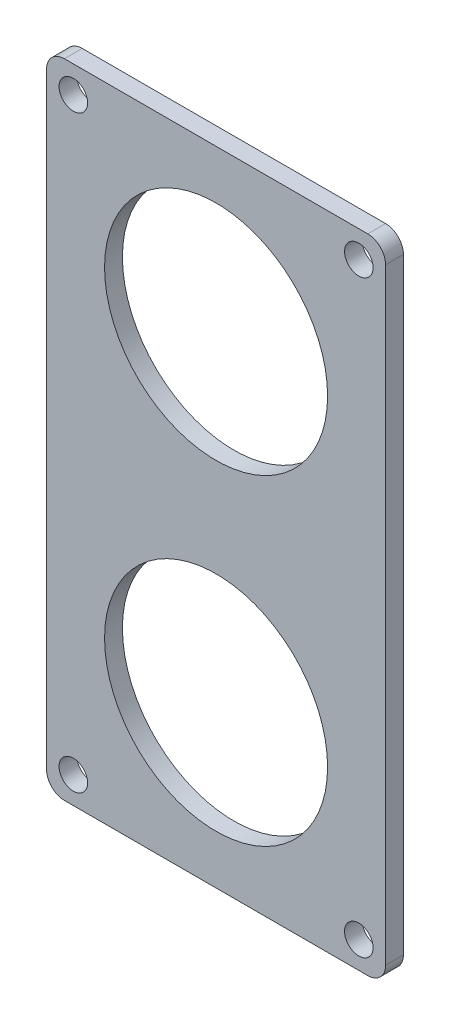
ISO-10303-21;
HEADER;
FILE_DESCRIPTION(('STEP AP214'),'2;1');
FILE_NAME('part.step','',(''),(''),'','','');
FILE_SCHEMA(('AUTOMOTIVE_DESIGN { 1 0 10303 214 1 1 1 1 }'));
ENDSEC;
DATA;
#1=APPLICATION_CONTEXT('core data for automotive mechanical design processes');
#2=APPLICATION_PROTOCOL_DEFINITION('international standard','automotive_design',2000,#1);
#3=PRODUCT_CONTEXT('',#1,'mechanical');
#4=PRODUCT('Part','Part','',(#3));
#5=PRODUCT_RELATED_PRODUCT_CATEGORY('part','',(#4));
#6=PRODUCT_DEFINITION_FORMATION('','',#4);
#7=PRODUCT_DEFINITION_CONTEXT('part definition',#1,'design');
#8=PRODUCT_DEFINITION('design','',#6,#7);
#9=PRODUCT_DEFINITION_SHAPE('','',#8);
#10=(LENGTH_UNIT() NAMED_UNIT(*) SI_UNIT(.MILLI.,.METRE.));
#11=(NAMED_UNIT(*) PLANE_ANGLE_UNIT() SI_UNIT($,.RADIAN.));
#12=(NAMED_UNIT(*) SI_UNIT($,.STERADIAN.) SOLID_ANGLE_UNIT());
#13=UNCERTAINTY_MEASURE_WITH_UNIT(LENGTH_MEASURE(1.E-05),#10,'distance_accuracy_value','');
#14=(GEOMETRIC_REPRESENTATION_CONTEXT(3) GLOBAL_UNCERTAINTY_ASSIGNED_CONTEXT((#13)) GLOBAL_UNIT_ASSIGNED_CONTEXT((#10,
#11,#12)) REPRESENTATION_CONTEXT('',''));
#15=CARTESIAN_POINT('',(0.,0.,0.));
#16=DIRECTION('',(0.,0.,1.));
#17=DIRECTION('',(1.,0.,0.));
#18=AXIS2_PLACEMENT_3D('',#15,#16,#17);
#19=CARTESIAN_POINT('',(20.5,54.2999999999998,2.));
#20=DIRECTION('',(0.,0.,1.));
#21=DIRECTION('',(1.,0.,0.));
#22=AXIS2_PLACEMENT_3D('',#19,#20,#21);
#23=PLANE('',#22);
#24=CARTESIAN_POINT('',(1.49999999999999,36.2999999999998,2.));
#25=DIRECTION('',(0.,0.,1.));
#26=DIRECTION('',(1.,0.,0.));
#27=AXIS2_PLACEMENT_3D('',#24,#25,#26);
#28=CIRCLE('',#27,12.5);
#29=CARTESIAN_POINT('',(14.,36.2999999999998,2.));
#30=VERTEX_POINT('',#29);
#31=EDGE_CURVE('E207',#30,#30,#28,.T.);
#32=ORIENTED_EDGE('',*,*,#31,.F.);
#33=EDGE_LOOP('',(#32));
#34=FACE_BOUND('',#33,.T.);
#35=CARTESIAN_POINT('',(1.49999999999999,0.299999999999835,2.));
#36=DIRECTION('',(0.,0.,1.));
#37=DIRECTION('',(1.,0.,0.));
#38=AXIS2_PLACEMENT_3D('',#35,#36,#37);
#39=CIRCLE('',#38,12.5);
#40=CARTESIAN_POINT('',(14.,0.299999999999835,2.));
#41=VERTEX_POINT('',#40);
#42=EDGE_CURVE('E201',#41,#41,#39,.T.);
#43=ORIENTED_EDGE('',*,*,#42,.F.);
#44=EDGE_LOOP('',(#43));
#45=FACE_BOUND('',#44,.T.);
#46=CARTESIAN_POINT('',(17.5,51.2999999999998,2.));
#47=DIRECTION('',(0.,0.,1.));
#48=DIRECTION('',(1.,0.,0.));
#49=AXIS2_PLACEMENT_3D('',#46,#47,#48);
#50=CIRCLE('',#49,1.6);
#51=CARTESIAN_POINT('',(19.1,51.2999999999998,2.));
#52=VERTEX_POINT('',#51);
#53=EDGE_CURVE('E186',#52,#52,#50,.T.);
#54=ORIENTED_EDGE('',*,*,#53,.F.);
#55=EDGE_LOOP('',(#54));
#56=FACE_BOUND('',#55,.T.);
#57=CARTESIAN_POINT('',(17.5,-14.7000000000002,2.));
#58=DIRECTION('',(0.,0.,1.));
#59=DIRECTION('',(1.,0.,0.));
#60=AXIS2_PLACEMENT_3D('',#57,#58,#59);
#61=CIRCLE('',#60,1.6);
#62=CARTESIAN_POINT('',(19.1,-14.7000000000002,2.));
#63=VERTEX_POINT('',#62);
#64=EDGE_CURVE('E172',#63,#63,#61,.T.);
#65=ORIENTED_EDGE('',*,*,#64,.F.);
#66=EDGE_LOOP('',(#65));
#67=FACE_BOUND('',#66,.T.);
#68=DIRECTION('',(-1.,0.,0.));
#69=VECTOR('',#68,1.);
#70=CARTESIAN_POINT('',(20.5,54.2999999999998,2.));
#71=LINE('',#70,#69);
#72=CARTESIAN_POINT('',(18.5,54.2999999999998,2.));
#73=VERTEX_POINT('',#72);
#74=CARTESIAN_POINT('',(-15.5,54.2999999999998,2.));
#75=VERTEX_POINT('',#74);
#76=EDGE_CURVE('E167',#73,#75,#71,.T.);
#77=ORIENTED_EDGE('',*,*,#76,.T.);
#78=CARTESIAN_POINT('',(-15.5,52.2999999999998,2.));
#79=DIRECTION('',(0.,0.,1.));
#80=DIRECTION('',(1.,0.,0.));
#81=AXIS2_PLACEMENT_3D('',#78,#79,#80);
#82=CIRCLE('',#81,2.);
#83=CARTESIAN_POINT('',(-17.5,52.2999999999998,2.));
#84=VERTEX_POINT('',#83);
#85=EDGE_CURVE('E148',#75,#84,#82,.T.);
#86=ORIENTED_EDGE('',*,*,#85,.T.);
#87=DIRECTION('',(0.,-1.,0.));
#88=VECTOR('',#87,1.);
#89=CARTESIAN_POINT('',(-17.5,-17.7000000000002,2.));
#90=LINE('',#89,#88);
#91=CARTESIAN_POINT('',(-17.5,-15.7000000000002,2.));
#92=VERTEX_POINT('',#91);
#93=EDGE_CURVE('E118',#84,#92,#90,.T.);
#94=ORIENTED_EDGE('',*,*,#93,.T.);
#95=CARTESIAN_POINT('',(-15.5,-15.7000000000002,2.));
#96=DIRECTION('',(0.,0.,1.));
#97=DIRECTION('',(1.,0.,0.));
#98=AXIS2_PLACEMENT_3D('',#95,#96,#97);
#99=CIRCLE('',#98,2.);
#100=CARTESIAN_POINT('',(-15.5,-17.7000000000002,2.));
#101=VERTEX_POINT('',#100);
#102=EDGE_CURVE('E54',#92,#101,#99,.T.);
#103=ORIENTED_EDGE('',*,*,#102,.T.);
#104=DIRECTION('',(1.,0.,0.));
#105=VECTOR('',#104,1.);
#106=CARTESIAN_POINT('',(20.5,-17.7000000000002,2.));
#107=LINE('',#106,#105);
#108=CARTESIAN_POINT('',(18.5,-17.7000000000002,2.));
#109=VERTEX_POINT('',#108);
#110=EDGE_CURVE('E134',#101,#109,#107,.T.);
#111=ORIENTED_EDGE('',*,*,#110,.T.);
#112=CARTESIAN_POINT('',(18.5,-15.7000000000002,2.));
#113=DIRECTION('',(0.,0.,1.));
#114=DIRECTION('',(1.,0.,0.));
#115=AXIS2_PLACEMENT_3D('',#112,#113,#114);
#116=CIRCLE('',#115,2.);
#117=CARTESIAN_POINT('',(20.5,-15.7000000000002,2.));
#118=VERTEX_POINT('',#117);
#119=EDGE_CURVE('E145',#109,#118,#116,.T.);
#120=ORIENTED_EDGE('',*,*,#119,.T.);
#121=DIRECTION('',(0.,1.,0.));
#122=VECTOR('',#121,1.);
#123=CARTESIAN_POINT('',(20.5,-17.7000000000002,2.));
#124=LINE('',#123,#122);
#125=CARTESIAN_POINT('',(20.5,52.2999999999998,2.));
#126=VERTEX_POINT('',#125);
#127=EDGE_CURVE('E128',#118,#126,#124,.T.);
#128=ORIENTED_EDGE('',*,*,#127,.T.);
#129=CARTESIAN_POINT('',(18.5,52.2999999999998,2.));
#130=DIRECTION('',(0.,0.,1.));
#131=DIRECTION('',(1.,0.,0.));
#132=AXIS2_PLACEMENT_3D('',#129,#130,#131);
#133=CIRCLE('',#132,2.);
#134=EDGE_CURVE('E143',#126,#73,#133,.T.);
#135=ORIENTED_EDGE('',*,*,#134,.T.);
#136=EDGE_LOOP('',(#77,#86,#94,#103,#111,#120,#128,#135));
#137=FACE_BOUND('',#136,.T.);
#138=CARTESIAN_POINT('',(-14.5,-14.7000000000002,2.));
#139=DIRECTION('',(0.,0.,1.));
#140=DIRECTION('',(1.,0.,0.));
#141=AXIS2_PLACEMENT_3D('',#138,#139,#140);
#142=CIRCLE('',#141,1.6);
#143=CARTESIAN_POINT('',(-12.9,-14.7000000000002,2.));
#144=VERTEX_POINT('',#143);
#145=EDGE_CURVE('E181',#144,#144,#142,.T.);
#146=ORIENTED_EDGE('',*,*,#145,.F.);
#147=EDGE_LOOP('',(#146));
#148=FACE_BOUND('',#147,.T.);
#149=CARTESIAN_POINT('',(-14.5,51.2999999999998,2.));
#150=DIRECTION('',(0.,0.,1.));
#151=DIRECTION('',(1.,0.,0.));
#152=AXIS2_PLACEMENT_3D('',#149,#150,#151);
#153=CIRCLE('',#152,1.6);
#154=CARTESIAN_POINT('',(-12.9,51.2999999999998,2.));
#155=VERTEX_POINT('',#154);
#156=EDGE_CURVE('E192',#155,#155,#153,.T.);
#157=ORIENTED_EDGE('',*,*,#156,.F.);
#158=EDGE_LOOP('',(#157));
#159=FACE_BOUND('',#158,.T.);
#160=ADVANCED_FACE('F32',(#34,#45,#56,#67,#137,#148,#159),#23,.T.);
#161=CARTESIAN_POINT('',(20.5,54.2999999999998,0.));
#162=DIRECTION('',(0.,0.,1.));
#163=DIRECTION('',(1.,0.,0.));
#164=AXIS2_PLACEMENT_3D('',#161,#162,#163);
#165=PLANE('',#164);
#166=CARTESIAN_POINT('',(1.49999999999999,36.2999999999998,0.));
#167=DIRECTION('',(0.,0.,1.));
#168=DIRECTION('',(1.,0.,0.));
#169=AXIS2_PLACEMENT_3D('',#166,#167,#168);
#170=CIRCLE('',#169,12.5);
#171=CARTESIAN_POINT('',(14.,36.2999999999998,0.));
#172=VERTEX_POINT('',#171);
#173=EDGE_CURVE('E204',#172,#172,#170,.T.);
#174=ORIENTED_EDGE('',*,*,#173,.T.);
#175=EDGE_LOOP('',(#174));
#176=FACE_BOUND('',#175,.T.);
#177=CARTESIAN_POINT('',(1.49999999999999,0.299999999999835,0.));
#178=DIRECTION('',(0.,0.,1.));
#179=DIRECTION('',(1.,0.,0.));
#180=AXIS2_PLACEMENT_3D('',#177,#178,#179);
#181=CIRCLE('',#180,12.5);
#182=CARTESIAN_POINT('',(14.,0.299999999999835,0.));
#183=VERTEX_POINT('',#182);
#184=EDGE_CURVE('E198',#183,#183,#181,.T.);
#185=ORIENTED_EDGE('',*,*,#184,.T.);
#186=EDGE_LOOP('',(#185));
#187=FACE_BOUND('',#186,.T.);
#188=CARTESIAN_POINT('',(17.5,51.2999999999998,0.));
#189=DIRECTION('',(0.,0.,1.));
#190=DIRECTION('',(1.,0.,0.));
#191=AXIS2_PLACEMENT_3D('',#188,#189,#190);
#192=CIRCLE('',#191,1.6);
#193=CARTESIAN_POINT('',(19.1,51.2999999999998,0.));
#194=VERTEX_POINT('',#193);
#195=EDGE_CURVE('E189',#194,#194,#192,.T.);
#196=ORIENTED_EDGE('',*,*,#195,.T.);
#197=EDGE_LOOP('',(#196));
#198=FACE_BOUND('',#197,.T.);
#199=CARTESIAN_POINT('',(17.5,-14.7000000000002,0.));
#200=DIRECTION('',(0.,0.,1.));
#201=DIRECTION('',(1.,0.,0.));
#202=AXIS2_PLACEMENT_3D('',#199,#200,#201);
#203=CIRCLE('',#202,1.6);
#204=CARTESIAN_POINT('',(19.1,-14.7000000000002,0.));
#205=VERTEX_POINT('',#204);
#206=EDGE_CURVE('E174',#205,#205,#203,.T.);
#207=ORIENTED_EDGE('',*,*,#206,.T.);
#208=EDGE_LOOP('',(#207));
#209=FACE_BOUND('',#208,.T.);
#210=DIRECTION('',(0.,-1.,0.));
#211=VECTOR('',#210,1.);
#212=CARTESIAN_POINT('',(-17.5,-17.7000000000002,0.));
#213=LINE('',#212,#211);
#214=CARTESIAN_POINT('',(-17.5,52.2999999999998,0.));
#215=VERTEX_POINT('',#214);
#216=CARTESIAN_POINT('',(-17.5,-15.7000000000002,0.));
#217=VERTEX_POINT('',#216);
#218=EDGE_CURVE('E116',#215,#217,#213,.T.);
#219=ORIENTED_EDGE('',*,*,#218,.F.);
#220=CARTESIAN_POINT('',(-15.5,52.2999999999998,0.));
#221=DIRECTION('',(0.,0.,1.));
#222=DIRECTION('',(1.,0.,0.));
#223=AXIS2_PLACEMENT_3D('',#220,#221,#222);
#224=CIRCLE('',#223,2.);
#225=CARTESIAN_POINT('',(-15.5,54.2999999999998,0.));
#226=VERTEX_POINT('',#225);
#227=EDGE_CURVE('E99',#215,#226,#224,.F.);
#228=ORIENTED_EDGE('',*,*,#227,.T.);
#229=DIRECTION('',(-1.,0.,0.));
#230=VECTOR('',#229,1.);
#231=CARTESIAN_POINT('',(20.5,54.2999999999998,0.));
#232=LINE('',#231,#230);
#233=CARTESIAN_POINT('',(18.5,54.2999999999998,0.));
#234=VERTEX_POINT('',#233);
#235=EDGE_CURVE('E126',#234,#226,#232,.T.);
#236=ORIENTED_EDGE('',*,*,#235,.F.);
#237=CARTESIAN_POINT('',(18.5,52.2999999999998,0.));
#238=DIRECTION('',(0.,0.,1.));
#239=DIRECTION('',(1.,0.,0.));
#240=AXIS2_PLACEMENT_3D('',#237,#238,#239);
#241=CIRCLE('',#240,2.);
#242=CARTESIAN_POINT('',(20.5,52.2999999999998,0.));
#243=VERTEX_POINT('',#242);
#244=EDGE_CURVE('E119',#234,#243,#241,.F.);
#245=ORIENTED_EDGE('',*,*,#244,.T.);
#246=DIRECTION('',(0.,1.,0.));
#247=VECTOR('',#246,1.);
#248=CARTESIAN_POINT('',(20.5,-17.7000000000002,0.));
#249=LINE('',#248,#247);
#250=CARTESIAN_POINT('',(20.5,-15.7000000000002,0.));
#251=VERTEX_POINT('',#250);
#252=EDGE_CURVE('E130',#251,#243,#249,.T.);
#253=ORIENTED_EDGE('',*,*,#252,.F.);
#254=CARTESIAN_POINT('',(18.5,-15.7000000000002,0.));
#255=DIRECTION('',(0.,0.,1.));
#256=DIRECTION('',(1.,0.,0.));
#257=AXIS2_PLACEMENT_3D('',#254,#255,#256);
#258=CIRCLE('',#257,2.);
#259=CARTESIAN_POINT('',(18.5,-17.7000000000002,0.));
#260=VERTEX_POINT('',#259);
#261=EDGE_CURVE('E137',#251,#260,#258,.F.);
#262=ORIENTED_EDGE('',*,*,#261,.T.);
#263=DIRECTION('',(1.,0.,0.));
#264=VECTOR('',#263,1.);
#265=CARTESIAN_POINT('',(20.5,-17.7000000000002,0.));
#266=LINE('',#265,#264);
#267=CARTESIAN_POINT('',(-15.5,-17.7000000000002,0.));
#268=VERTEX_POINT('',#267);
#269=EDGE_CURVE('E125',#268,#260,#266,.T.);
#270=ORIENTED_EDGE('',*,*,#269,.F.);
#271=CARTESIAN_POINT('',(-15.5,-15.7000000000002,0.));
#272=DIRECTION('',(0.,0.,1.));
#273=DIRECTION('',(1.,0.,0.));
#274=AXIS2_PLACEMENT_3D('',#271,#272,#273);
#275=CIRCLE('',#274,2.);
#276=EDGE_CURVE('E110',#268,#217,#275,.F.);
#277=ORIENTED_EDGE('',*,*,#276,.T.);
#278=EDGE_LOOP('',(#219,#228,#236,#245,#253,#262,#270,#277));
#279=FACE_BOUND('',#278,.T.);
#280=CARTESIAN_POINT('',(-14.5,-14.7000000000002,0.));
#281=DIRECTION('',(0.,0.,1.));
#282=DIRECTION('',(1.,0.,0.));
#283=AXIS2_PLACEMENT_3D('',#280,#281,#282);
#284=CIRCLE('',#283,1.6);
#285=CARTESIAN_POINT('',(-12.9,-14.7000000000002,0.));
#286=VERTEX_POINT('',#285);
#287=EDGE_CURVE('E183',#286,#286,#284,.T.);
#288=ORIENTED_EDGE('',*,*,#287,.T.);
#289=EDGE_LOOP('',(#288));
#290=FACE_BOUND('',#289,.T.);
#291=CARTESIAN_POINT('',(-14.5,51.2999999999998,0.));
#292=DIRECTION('',(0.,0.,1.));
#293=DIRECTION('',(1.,0.,0.));
#294=AXIS2_PLACEMENT_3D('',#291,#292,#293);
#295=CIRCLE('',#294,1.6);
#296=CARTESIAN_POINT('',(-12.9,51.2999999999998,0.));
#297=VERTEX_POINT('',#296);
#298=EDGE_CURVE('E195',#297,#297,#295,.T.);
#299=ORIENTED_EDGE('',*,*,#298,.T.);
#300=EDGE_LOOP('',(#299));
#301=FACE_BOUND('',#300,.T.);
#302=ADVANCED_FACE('F122',(#176,#187,#198,#209,#279,#290,#301),#165,.F.);
#303=CARTESIAN_POINT('',(20.5,-17.7000000000002,2.));
#304=DIRECTION('',(-1.,0.,0.));
#305=DIRECTION('',(0.,0.,1.));
#306=AXIS2_PLACEMENT_3D('',#303,#304,#305);
#307=PLANE('',#306);
#308=ORIENTED_EDGE('',*,*,#127,.F.);
#309=DIRECTION('',(0.,0.,-1.));
#310=VECTOR('',#309,1.);
#311=CARTESIAN_POINT('',(20.5,-15.7000000000002,2.));
#312=LINE('',#311,#310);
#313=EDGE_CURVE('E11',#118,#251,#312,.T.);
#314=ORIENTED_EDGE('',*,*,#313,.T.);
#315=ORIENTED_EDGE('',*,*,#252,.T.);
#316=DIRECTION('',(0.,0.,-1.));
#317=VECTOR('',#316,1.);
#318=CARTESIAN_POINT('',(20.5,52.2999999999998,2.));
#319=LINE('',#318,#317);
#320=EDGE_CURVE('E40',#243,#126,#319,.F.);
#321=ORIENTED_EDGE('',*,*,#320,.T.);
#322=EDGE_LOOP('',(#308,#314,#315,#321));
#323=FACE_BOUND('',#322,.T.);
#324=ADVANCED_FACE('F158',(#323),#307,.F.);
#325=CARTESIAN_POINT('',(20.5,54.2999999999998,2.));
#326=DIRECTION('',(0.,-1.,0.));
#327=DIRECTION('',(0.,0.,-1.));
#328=AXIS2_PLACEMENT_3D('',#325,#326,#327);
#329=PLANE('',#328);
#330=ORIENTED_EDGE('',*,*,#235,.T.);
#331=DIRECTION('',(0.,0.,-1.));
#332=VECTOR('',#331,1.);
#333=CARTESIAN_POINT('',(-15.5,54.2999999999998,2.));
#334=LINE('',#333,#332);
#335=EDGE_CURVE('E104',#226,#75,#334,.F.);
#336=ORIENTED_EDGE('',*,*,#335,.T.);
#337=ORIENTED_EDGE('',*,*,#76,.F.);
#338=DIRECTION('',(0.,0.,-1.));
#339=VECTOR('',#338,1.);
#340=CARTESIAN_POINT('',(18.5,54.2999999999998,2.));
#341=LINE('',#340,#339);
#342=EDGE_CURVE('E109',#73,#234,#341,.T.);
#343=ORIENTED_EDGE('',*,*,#342,.T.);
#344=EDGE_LOOP('',(#330,#336,#337,#343));
#345=FACE_BOUND('',#344,.T.);
#346=ADVANCED_FACE('F171',(#345),#329,.F.);
#347=CARTESIAN_POINT('',(-17.5,-17.7000000000002,2.));
#348=DIRECTION('',(1.,0.,0.));
#349=DIRECTION('',(0.,0.,-1.));
#350=AXIS2_PLACEMENT_3D('',#347,#348,#349);
#351=PLANE('',#350);
#352=ORIENTED_EDGE('',*,*,#93,.F.);
#353=DIRECTION('',(0.,0.,-1.));
#354=VECTOR('',#353,1.);
#355=CARTESIAN_POINT('',(-17.5,52.2999999999998,2.));
#356=LINE('',#355,#354);
#357=EDGE_CURVE('E103',#84,#215,#356,.T.);
#358=ORIENTED_EDGE('',*,*,#357,.T.);
#359=ORIENTED_EDGE('',*,*,#218,.T.);
#360=DIRECTION('',(0.,0.,-1.));
#361=VECTOR('',#360,1.);
#362=CARTESIAN_POINT('',(-17.5,-15.7000000000002,2.));
#363=LINE('',#362,#361);
#364=EDGE_CURVE('E120',#217,#92,#363,.F.);
#365=ORIENTED_EDGE('',*,*,#364,.T.);
#366=EDGE_LOOP('',(#352,#358,#359,#365));
#367=FACE_BOUND('',#366,.T.);
#368=ADVANCED_FACE('F115',(#367),#351,.F.);
#369=CARTESIAN_POINT('',(20.5,-17.7000000000002,2.));
#370=DIRECTION('',(0.,1.,0.));
#371=DIRECTION('',(-1.,0.,0.));
#372=AXIS2_PLACEMENT_3D('',#369,#370,#371);
#373=PLANE('',#372);
#374=ORIENTED_EDGE('',*,*,#110,.F.);
#375=DIRECTION('',(0.,0.,-1.));
#376=VECTOR('',#375,1.);
#377=CARTESIAN_POINT('',(-15.5,-17.7000000000002,2.));
#378=LINE('',#377,#376);
#379=EDGE_CURVE('E151',#101,#268,#378,.T.);
#380=ORIENTED_EDGE('',*,*,#379,.T.);
#381=ORIENTED_EDGE('',*,*,#269,.T.);
#382=DIRECTION('',(0.,0.,-1.));
#383=VECTOR('',#382,1.);
#384=CARTESIAN_POINT('',(18.5,-17.7000000000002,2.));
#385=LINE('',#384,#383);
#386=EDGE_CURVE('E47',#260,#109,#385,.F.);
#387=ORIENTED_EDGE('',*,*,#386,.T.);
#388=EDGE_LOOP('',(#374,#380,#381,#387));
#389=FACE_BOUND('',#388,.T.);
#390=ADVANCED_FACE('F235',(#389),#373,.F.);
#391=CARTESIAN_POINT('',(17.5,-14.7000000000002,2.));
#392=DIRECTION('',(0.,0.,-1.));
#393=DIRECTION('',(-1.,0.,0.));
#394=AXIS2_PLACEMENT_3D('',#391,#392,#393);
#395=CYLINDRICAL_SURFACE('',#394,1.6);
#396=ORIENTED_EDGE('',*,*,#64,.T.);
#397=EDGE_LOOP('',(#396));
#398=FACE_BOUND('',#397,.T.);
#399=ORIENTED_EDGE('',*,*,#206,.F.);
#400=EDGE_LOOP('',(#399));
#401=FACE_BOUND('',#400,.T.);
#402=ADVANCED_FACE('F231',(#398,#401),#395,.F.);
#403=CARTESIAN_POINT('',(-14.5,-14.7000000000002,2.));
#404=DIRECTION('',(0.,0.,-1.));
#405=DIRECTION('',(-1.,0.,0.));
#406=AXIS2_PLACEMENT_3D('',#403,#404,#405);
#407=CYLINDRICAL_SURFACE('',#406,1.6);
#408=ORIENTED_EDGE('',*,*,#145,.T.);
#409=EDGE_LOOP('',(#408));
#410=FACE_BOUND('',#409,.T.);
#411=ORIENTED_EDGE('',*,*,#287,.F.);
#412=EDGE_LOOP('',(#411));
#413=FACE_BOUND('',#412,.T.);
#414=ADVANCED_FACE('F234',(#410,#413),#407,.F.);
#415=CARTESIAN_POINT('',(17.5,51.2999999999998,2.));
#416=DIRECTION('',(0.,0.,-1.));
#417=DIRECTION('',(-1.,0.,0.));
#418=AXIS2_PLACEMENT_3D('',#415,#416,#417);
#419=CYLINDRICAL_SURFACE('',#418,1.6);
#420=ORIENTED_EDGE('',*,*,#53,.T.);
#421=EDGE_LOOP('',(#420));
#422=FACE_BOUND('',#421,.T.);
#423=ORIENTED_EDGE('',*,*,#195,.F.);
#424=EDGE_LOOP('',(#423));
#425=FACE_BOUND('',#424,.T.);
#426=ADVANCED_FACE('F341',(#422,#425),#419,.F.);
#427=CARTESIAN_POINT('',(-14.5,51.2999999999998,2.));
#428=DIRECTION('',(0.,0.,-1.));
#429=DIRECTION('',(-1.,0.,0.));
#430=AXIS2_PLACEMENT_3D('',#427,#428,#429);
#431=CYLINDRICAL_SURFACE('',#430,1.6);
#432=ORIENTED_EDGE('',*,*,#156,.T.);
#433=EDGE_LOOP('',(#432));
#434=FACE_BOUND('',#433,.T.);
#435=ORIENTED_EDGE('',*,*,#298,.F.);
#436=EDGE_LOOP('',(#435));
#437=FACE_BOUND('',#436,.T.);
#438=ADVANCED_FACE('F331',(#434,#437),#431,.F.);
#439=CARTESIAN_POINT('',(1.49999999999999,0.299999999999835,0.));
#440=DIRECTION('',(0.,0.,1.));
#441=DIRECTION('',(1.,0.,0.));
#442=AXIS2_PLACEMENT_3D('',#439,#440,#441);
#443=CYLINDRICAL_SURFACE('',#442,12.5);
#444=ORIENTED_EDGE('',*,*,#184,.F.);
#445=EDGE_LOOP('',(#444));
#446=FACE_BOUND('',#445,.T.);
#447=ORIENTED_EDGE('',*,*,#42,.T.);
#448=EDGE_LOOP('',(#447));
#449=FACE_BOUND('',#448,.T.);
#450=ADVANCED_FACE('F218',(#446,#449),#443,.F.);
#451=CARTESIAN_POINT('',(1.49999999999999,36.2999999999998,0.));
#452=DIRECTION('',(0.,0.,1.));
#453=DIRECTION('',(1.,0.,0.));
#454=AXIS2_PLACEMENT_3D('',#451,#452,#453);
#455=CYLINDRICAL_SURFACE('',#454,12.5);
#456=ORIENTED_EDGE('',*,*,#173,.F.);
#457=EDGE_LOOP('',(#456));
#458=FACE_BOUND('',#457,.T.);
#459=ORIENTED_EDGE('',*,*,#31,.T.);
#460=EDGE_LOOP('',(#459));
#461=FACE_BOUND('',#460,.T.);
#462=ADVANCED_FACE('F215',(#458,#461),#455,.F.);
#463=CARTESIAN_POINT('',(-15.5,52.2999999999998,2.));
#464=DIRECTION('',(0.,0.,-1.));
#465=DIRECTION('',(-1.,0.,0.));
#466=AXIS2_PLACEMENT_3D('',#463,#464,#465);
#467=CYLINDRICAL_SURFACE('',#466,2.);
#468=ORIENTED_EDGE('',*,*,#85,.F.);
#469=ORIENTED_EDGE('',*,*,#335,.F.);
#470=ORIENTED_EDGE('',*,*,#227,.F.);
#471=ORIENTED_EDGE('',*,*,#357,.F.);
#472=EDGE_LOOP('',(#468,#469,#470,#471));
#473=FACE_BOUND('',#472,.T.);
#474=ADVANCED_FACE('F102',(#473),#467,.T.);
#475=CARTESIAN_POINT('',(-15.5,-15.7000000000002,2.));
#476=DIRECTION('',(0.,0.,-1.));
#477=DIRECTION('',(-1.,0.,0.));
#478=AXIS2_PLACEMENT_3D('',#475,#476,#477);
#479=CYLINDRICAL_SURFACE('',#478,2.);
#480=ORIENTED_EDGE('',*,*,#102,.F.);
#481=ORIENTED_EDGE('',*,*,#364,.F.);
#482=ORIENTED_EDGE('',*,*,#276,.F.);
#483=ORIENTED_EDGE('',*,*,#379,.F.);
#484=EDGE_LOOP('',(#480,#481,#482,#483));
#485=FACE_BOUND('',#484,.T.);
#486=ADVANCED_FACE('F254',(#485),#479,.T.);
#487=CARTESIAN_POINT('',(18.5,-15.7000000000002,2.));
#488=DIRECTION('',(0.,0.,-1.));
#489=DIRECTION('',(-1.,0.,0.));
#490=AXIS2_PLACEMENT_3D('',#487,#488,#489);
#491=CYLINDRICAL_SURFACE('',#490,2.);
#492=ORIENTED_EDGE('',*,*,#119,.F.);
#493=ORIENTED_EDGE('',*,*,#386,.F.);
#494=ORIENTED_EDGE('',*,*,#261,.F.);
#495=ORIENTED_EDGE('',*,*,#313,.F.);
#496=EDGE_LOOP('',(#492,#493,#494,#495));
#497=FACE_BOUND('',#496,.T.);
#498=ADVANCED_FACE('F256',(#497),#491,.T.);
#499=CARTESIAN_POINT('',(18.5,52.2999999999998,2.));
#500=DIRECTION('',(0.,0.,-1.));
#501=DIRECTION('',(-1.,0.,0.));
#502=AXIS2_PLACEMENT_3D('',#499,#500,#501);
#503=CYLINDRICAL_SURFACE('',#502,2.);
#504=ORIENTED_EDGE('',*,*,#134,.F.);
#505=ORIENTED_EDGE('',*,*,#320,.F.);
#506=ORIENTED_EDGE('',*,*,#244,.F.);
#507=ORIENTED_EDGE('',*,*,#342,.F.);
#508=EDGE_LOOP('',(#504,#505,#506,#507));
#509=FACE_BOUND('',#508,.T.);
#510=ADVANCED_FACE('F34',(#509),#503,.T.);
#511=CLOSED_SHELL('',(#160,#302,#324,#346,#368,#390,#402,#414,#426,#438,#450,#462,#474,#486,
#498,#510));
#512=MANIFOLD_SOLID_BREP('B2',#511);
#513=ADVANCED_BREP_SHAPE_REPRESENTATION('',(#18,#512),#14);
#514=SHAPE_DEFINITION_REPRESENTATION(#9,#513);
ENDSEC;
END-ISO-10303-21;
